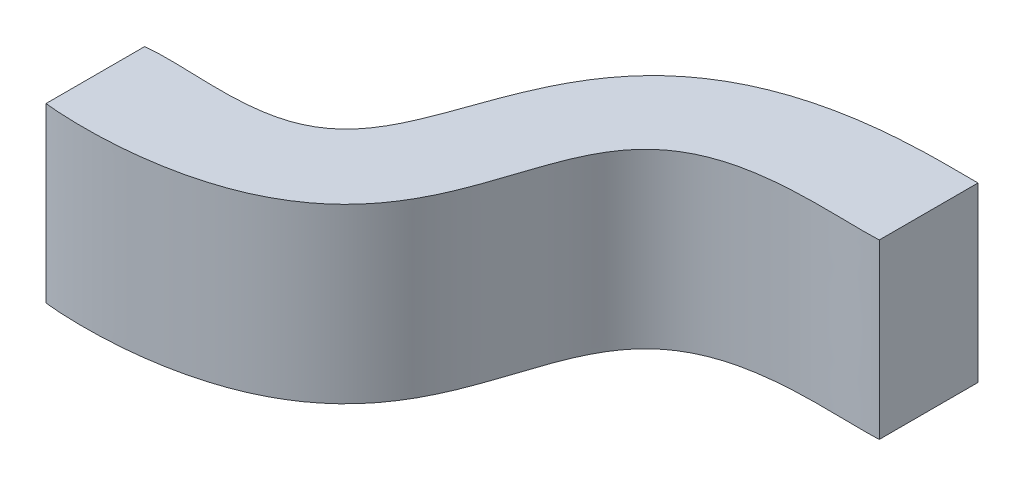
ISO-10303-21;
HEADER;
FILE_DESCRIPTION(('STEP AP214'),'2;1');
FILE_NAME('part.step','',(''),(''),'','','');
FILE_SCHEMA(('AUTOMOTIVE_DESIGN { 1 0 10303 214 1 1 1 1 }'));
ENDSEC;
DATA;
#1=APPLICATION_CONTEXT('core data for automotive mechanical design processes');
#2=APPLICATION_PROTOCOL_DEFINITION('international standard','automotive_design',2000,#1);
#3=PRODUCT_CONTEXT('',#1,'mechanical');
#4=PRODUCT('Part','Part','',(#3));
#5=PRODUCT_RELATED_PRODUCT_CATEGORY('part','',(#4));
#6=PRODUCT_DEFINITION_FORMATION('','',#4);
#7=PRODUCT_DEFINITION_CONTEXT('part definition',#1,'design');
#8=PRODUCT_DEFINITION('design','',#6,#7);
#9=PRODUCT_DEFINITION_SHAPE('','',#8);
#10=(LENGTH_UNIT() NAMED_UNIT(*) SI_UNIT(.MILLI.,.METRE.));
#11=(NAMED_UNIT(*) PLANE_ANGLE_UNIT() SI_UNIT($,.RADIAN.));
#12=(NAMED_UNIT(*) SI_UNIT($,.STERADIAN.) SOLID_ANGLE_UNIT());
#13=UNCERTAINTY_MEASURE_WITH_UNIT(LENGTH_MEASURE(1.E-05),#10,'distance_accuracy_value','');
#14=(GEOMETRIC_REPRESENTATION_CONTEXT(3) GLOBAL_UNCERTAINTY_ASSIGNED_CONTEXT((#13)) GLOBAL_UNIT_ASSIGNED_CONTEXT((#10,
#11,#12)) REPRESENTATION_CONTEXT('',''));
#15=CARTESIAN_POINT('',(0.,0.,0.));
#16=DIRECTION('',(0.,0.,1.));
#17=DIRECTION('',(1.,0.,0.));
#18=AXIS2_PLACEMENT_3D('',#15,#16,#17);
#19=CARTESIAN_POINT('',(3.,1.695,0.269440972087));
#20=DIRECTION('',(1.,0.,0.));
#21=DIRECTION('',(0.,1.,0.));
#22=AXIS2_PLACEMENT_3D('',#19,#20,#21);
#23=PLANE('',#22);
#24=DIRECTION('',(0.,-1.,-7.441666330773E-12));
#25=VECTOR('',#24,1.);
#26=CARTESIAN_POINT('',(2.999999999871,2.115,0.02944097209247));
#27=LINE('',#26,#25);
#28=CARTESIAN_POINT('',(2.999999999871,2.115,0.02944097209247));
#29=VERTEX_POINT('',#28);
#30=CARTESIAN_POINT('',(2.999999999871,1.695,0.02944097208934));
#31=VERTEX_POINT('',#30);
#32=EDGE_CURVE('E59',#29,#31,#27,.T.);
#33=ORIENTED_EDGE('',*,*,#32,.F.);
#34=DIRECTION('',(-5.363006335442E-10,0.,-1.));
#35=VECTOR('',#34,1.);
#36=CARTESIAN_POINT('',(3.,2.115,0.269440972087));
#37=LINE('',#36,#35);
#38=CARTESIAN_POINT('',(3.,2.115,0.269440972087));
#39=VERTEX_POINT('',#38);
#40=EDGE_CURVE('E28',#39,#29,#37,.T.);
#41=ORIENTED_EDGE('',*,*,#40,.F.);
#42=DIRECTION('',(0.,1.,0.));
#43=VECTOR('',#42,1.);
#44=CARTESIAN_POINT('',(3.,1.695,0.269440972087));
#45=LINE('',#44,#43);
#46=CARTESIAN_POINT('',(3.,1.695,0.269440972087));
#47=VERTEX_POINT('',#46);
#48=EDGE_CURVE('E98',#47,#39,#45,.T.);
#49=ORIENTED_EDGE('',*,*,#48,.F.);
#50=DIRECTION('',(5.363024839089E-10,0.,1.));
#51=VECTOR('',#50,1.);
#52=CARTESIAN_POINT('',(2.999999999871,1.695,0.02944097208934));
#53=LINE('',#52,#51);
#54=EDGE_CURVE('E85',#31,#47,#53,.T.);
#55=ORIENTED_EDGE('',*,*,#54,.F.);
#56=EDGE_LOOP('',(#33,#41,#49,#55));
#57=FACE_BOUND('',#56,.T.);
#58=ADVANCED_FACE('F17',(#57),#23,.T.);
#59=CARTESIAN_POINT('',(1.7,1.695,0.995));
#60=DIRECTION('',(1.,0.,0.));
#61=DIRECTION('',(0.,1.,0.));
#62=AXIS2_PLACEMENT_3D('',#59,#60,#61);
#63=PLANE('',#62);
#64=DIRECTION('',(0.,1.,0.));
#65=VECTOR('',#64,1.);
#66=CARTESIAN_POINT('',(1.7,1.695,0.755));
#67=LINE('',#66,#65);
#68=CARTESIAN_POINT('',(1.7,1.695,0.755));
#69=VERTEX_POINT('',#68);
#70=CARTESIAN_POINT('',(1.7,2.115,0.755));
#71=VERTEX_POINT('',#70);
#72=EDGE_CURVE('E112',#69,#71,#67,.T.);
#73=ORIENTED_EDGE('',*,*,#72,.F.);
#74=DIRECTION('',(0.,0.,-1.));
#75=VECTOR('',#74,1.);
#76=CARTESIAN_POINT('',(1.7,1.695,0.995));
#77=LINE('',#76,#75);
#78=CARTESIAN_POINT('',(1.7,1.695,0.995));
#79=VERTEX_POINT('',#78);
#80=EDGE_CURVE('E65',#79,#69,#77,.T.);
#81=ORIENTED_EDGE('',*,*,#80,.F.);
#82=DIRECTION('',(0.,-1.,0.));
#83=VECTOR('',#82,1.);
#84=CARTESIAN_POINT('',(1.7,2.115,0.995));
#85=LINE('',#84,#83);
#86=CARTESIAN_POINT('',(1.7,2.115,0.995));
#87=VERTEX_POINT('',#86);
#88=EDGE_CURVE('E100',#87,#79,#85,.T.);
#89=ORIENTED_EDGE('',*,*,#88,.F.);
#90=DIRECTION('',(0.,0.,1.));
#91=VECTOR('',#90,1.);
#92=CARTESIAN_POINT('',(1.7,2.115,0.755));
#93=LINE('',#92,#91);
#94=EDGE_CURVE('E11',#71,#87,#93,.T.);
#95=ORIENTED_EDGE('',*,*,#94,.F.);
#96=EDGE_LOOP('',(#73,#81,#89,#95));
#97=FACE_BOUND('',#96,.T.);
#98=ADVANCED_FACE('F144',(#97),#63,.F.);
#99=CARTESIAN_POINT('',(1.7,2.115,0.995));
#100=DIRECTION('',(0.,-1.,0.));
#101=DIRECTION('',(0.,0.,-1.));
#102=AXIS2_PLACEMENT_3D('',#99,#100,#101);
#103=PLANE('',#102);
#104=ORIENTED_EDGE('',*,*,#40,.T.);
#105=CARTESIAN_POINT('',(1.7,2.115,0.755));
#106=CARTESIAN_POINT('',(1.728643494388,2.115,0.7518517855596));
#107=CARTESIAN_POINT('',(1.795333284024,2.115,0.7529114508954));
#108=CARTESIAN_POINT('',(1.900115249547,2.115,0.7568374269966));
#109=CARTESIAN_POINT('',(1.994893083273,2.115,0.7498880741509));
#110=CARTESIAN_POINT('',(2.072220157247,2.115,0.7244576197296));
#111=CARTESIAN_POINT('',(2.130616950677,2.115,0.6776761088199));
#112=CARTESIAN_POINT('',(2.173215353715,2.115,0.6105274657353));
#113=CARTESIAN_POINT('',(2.206407799143,2.115,0.5269706962931));
#114=CARTESIAN_POINT('',(2.238495100883,2.115,0.4330602488143));
#115=CARTESIAN_POINT('',(2.278334637343,2.115,0.3360665994647));
#116=CARTESIAN_POINT('',(2.333988448561,2.115,0.2435967815106));
#117=CARTESIAN_POINT('',(2.411371333342,2.115,0.1627149145743));
#118=CARTESIAN_POINT('',(2.512899032616,2.115,0.09906278997502));
#119=CARTESIAN_POINT('',(2.636136067925,2.115,0.05598023172917));
#120=CARTESIAN_POINT('',(2.772444873154,2.115,0.03362629882847));
#121=CARTESIAN_POINT('',(2.905630098084,2.115,0.02809734675068));
#122=CARTESIAN_POINT('',(2.975610653613,2.115,0.02973698941307));
#123=CARTESIAN_POINT('',(2.999999999871,2.115,0.02944097209247));
#124=B_SPLINE_CURVE_WITH_KNOTS('',3,(#105,#106,#107,#108,#109,#110,#111,#112,#113,#114,#115,
#116,#117,#118,#119,#120,#121,#122,#123),.UNSPECIFIED.,.F.,.F.,(4,1,1,1,1,1,1,1,1,1,1,1,1,1,1,1,
4),(0.,0.06250000001045,0.1250000000207,0.1875000000311,0.2500000000413,0.3125000000517,
0.375000000062,0.4375000000722,0.5000000000826,0.5625000000929,0.6250000001032,0.6875000001135,
0.7500000001237,0.8125000001341,0.8750000001444,0.9375000001546,1.),.UNSPECIFIED.);
#125=EDGE_CURVE('E117',#71,#29,#124,.T.);
#126=ORIENTED_EDGE('',*,*,#125,.F.);
#127=ORIENTED_EDGE('',*,*,#94,.T.);
#128=CARTESIAN_POINT('',(3.,2.115,0.269440972087));
#129=CARTESIAN_POINT('',(2.972739674819,2.115,0.2707819413465));
#130=CARTESIAN_POINT('',(2.903069519715,2.115,0.2690293220586));
#131=CARTESIAN_POINT('',(2.785338777859,2.115,0.2689332965312));
#132=CARTESIAN_POINT('',(2.675349164177,2.115,0.2817078173698));
#133=CARTESIAN_POINT('',(2.584588029793,2.115,0.3129701023117));
#134=CARTESIAN_POINT('',(2.51675546186,2.115,0.3643581895776));
#135=CARTESIAN_POINT('',(2.469479097315,2.115,0.4342821681339));
#136=CARTESIAN_POINT('',(2.436022829838,2.115,0.5186727326671));
#137=CARTESIAN_POINT('',(2.406997152547,2.115,0.6117304551543));
#138=CARTESIAN_POINT('',(2.372069064508,2.115,0.7066748653404));
#139=CARTESIAN_POINT('',(2.321672086288,2.115,0.7964935789889));
#140=CARTESIAN_POINT('',(2.248716275502,2.115,0.8746914261329));
#141=CARTESIAN_POINT('',(2.150298133324,2.115,0.9360395315528));
#142=CARTESIAN_POINT('',(2.029410947185,2.115,0.9773245863457));
#143=CARTESIAN_POINT('',(1.896653497727,2.115,0.9980974029006));
#144=CARTESIAN_POINT('',(1.771944872564,2.115,1.001424145161));
#145=CARTESIAN_POINT('',(1.714792616559,2.115,0.9968930979407));
#146=CARTESIAN_POINT('',(1.7,2.115,0.995));
#147=B_SPLINE_CURVE_WITH_KNOTS('',3,(#128,#129,#130,#131,#132,#133,#134,#135,#136,#137,#138,
#139,#140,#141,#142,#143,#144,#145,#146),.UNSPECIFIED.,.F.,.F.,(4,1,1,1,1,1,1,1,1,1,1,1,1,1,1,1,
4),(0.,0.06250000000019,0.1250000000002,0.1875000000002,0.2500000000002,0.3125000000003,
0.3750000000002,0.4375000000002,0.5000000000002,0.5625000000002,0.6250000000002,0.6875000000001,
0.7500000000002,0.8125000000002,0.8750000000002,0.9375000000002,1.),.UNSPECIFIED.);
#148=EDGE_CURVE('E21',#39,#87,#147,.T.);
#149=ORIENTED_EDGE('',*,*,#148,.F.);
#150=EDGE_LOOP('',(#104,#126,#127,#149));
#151=FACE_BOUND('',#150,.T.);
#152=ADVANCED_FACE('F19',(#151),#103,.F.);
#153=CARTESIAN_POINT('',(1.683640348767,2.115,0.7573154890361));
#154=CARTESIAN_POINT('',(1.688890946943,2.115,0.7563839724333));
#155=CARTESIAN_POINT('',(1.722070957262,2.115,0.7517473514356));
#156=CARTESIAN_POINT('',(1.795333284024,2.115,0.7529114508954));
#157=CARTESIAN_POINT('',(1.900115249547,2.115,0.7568374269966));
#158=CARTESIAN_POINT('',(1.994893083273,2.115,0.7498880741509));
#159=CARTESIAN_POINT('',(2.072220157247,2.115,0.7244576197296));
#160=CARTESIAN_POINT('',(2.130616950677,2.115,0.6776761088199));
#161=CARTESIAN_POINT('',(2.173215353715,2.115,0.6105274657353));
#162=CARTESIAN_POINT('',(2.206407799143,2.115,0.5269706962931));
#163=CARTESIAN_POINT('',(2.238495100883,2.115,0.4330602488143));
#164=CARTESIAN_POINT('',(2.278334637343,2.115,0.3360665994647));
#165=CARTESIAN_POINT('',(2.333988448561,2.115,0.2435967815106));
#166=CARTESIAN_POINT('',(2.411371333342,2.115,0.1627149145743));
#167=CARTESIAN_POINT('',(2.512899032615,2.115,0.09906278997499));
#168=CARTESIAN_POINT('',(2.636136067927,2.115,0.05598023172927));
#169=CARTESIAN_POINT('',(2.772444873146,2.115,0.03362629882808));
#170=CARTESIAN_POINT('',(2.905630098114,2.115,0.02809734675213));
#171=CARTESIAN_POINT('',(2.982867393509,2.115,0.02990701464513));
#172=CARTESIAN_POINT('',(3.009660395097,2.115,0.02927019391794));
#173=CARTESIAN_POINT('',(3.013754026833,2.115,0.02909098308841));
#174=(BOUNDED_CURVE() B_SPLINE_CURVE(3,(#153,#154,#155,#156,#157,#158,#159,#160,#161,#162,#163,
#164,#165,#166,#167,#168,#169,#170,#171,#172,#173),.UNSPECIFIED.,.F.,
.F.) B_SPLINE_CURVE_WITH_KNOTS((4,1,1,1,1,1,1,1,1,1,1,1,1,1,1,1,1,1,4),(0.,0.01201546762312,
0.07297434795032,0.1339332282773,0.1948921086045,0.2558509889315,0.3168098692586,
0.3777687495856,0.4387276299127,0.4996865102398,0.5606453905668,0.6216042708939,0.682563151221,
0.743522031548,0.8044809118751,0.8654397922021,0.9263986725292,0.9873575526954,1.),
.UNSPECIFIED.) CURVE() GEOMETRIC_REPRESENTATION_ITEM() RATIONAL_B_SPLINE_CURVE((1.,1.,1.,1.,1.,
1.,1.,1.,1.,1.,1.,1.,1.,1.,1.,1.,1.,1.,1.,1.,1.)) REPRESENTATION_ITEM(''));
#175=DIRECTION('',(0.,-1.,0.));
#176=VECTOR('',#175,1.);
#177=SURFACE_OF_LINEAR_EXTRUSION('',#174,#176);
#178=ORIENTED_EDGE('',*,*,#32,.T.);
#179=CARTESIAN_POINT('',(2.999999999871,1.695,0.02944097208934));
#180=CARTESIAN_POINT('',(2.975610653613,1.695,0.02973698940995));
#181=CARTESIAN_POINT('',(2.905630098084,1.695,0.02809734675213));
#182=CARTESIAN_POINT('',(2.772444873154,1.695,0.03362629882808));
#183=CARTESIAN_POINT('',(2.636136067925,1.695,0.05598023172927));
#184=CARTESIAN_POINT('',(2.512899032616,1.695,0.09906278997499));
#185=CARTESIAN_POINT('',(2.411371333342,1.695,0.1627149145743));
#186=CARTESIAN_POINT('',(2.333988448561,1.695,0.2435967815106));
#187=CARTESIAN_POINT('',(2.278334637343,1.695,0.3360665994647));
#188=CARTESIAN_POINT('',(2.238495100883,1.695,0.4330602488143));
#189=CARTESIAN_POINT('',(2.206407799143,1.695,0.5269706962931));
#190=CARTESIAN_POINT('',(2.173215353715,1.695,0.6105274657353));
#191=CARTESIAN_POINT('',(2.130616950677,1.695,0.6776761088199));
#192=CARTESIAN_POINT('',(2.072220157247,1.695,0.7244576197296));
#193=CARTESIAN_POINT('',(1.994893083273,1.695,0.7498880741509));
#194=CARTESIAN_POINT('',(1.900115249547,1.695,0.7568374269966));
#195=CARTESIAN_POINT('',(1.795333284024,1.695,0.7529114508954));
#196=CARTESIAN_POINT('',(1.728643494388,1.695,0.7518517855596));
#197=CARTESIAN_POINT('',(1.7,1.695,0.755));
#198=B_SPLINE_CURVE_WITH_KNOTS('',3,(#179,#180,#181,#182,#183,#184,#185,#186,#187,#188,#189,
#190,#191,#192,#193,#194,#195,#196,#197),.UNSPECIFIED.,.F.,.F.,(4,1,1,1,1,1,1,1,1,1,1,1,1,1,1,1,
4),(0.,0.06249999984537,0.1249999998556,0.1874999998659,0.2499999998763,0.3124999998865,
0.3749999998968,0.4374999999071,0.4999999999174,0.5624999999278,0.624999999938,0.6874999999483,
0.7499999999587,0.8124999999689,0.8749999999793,0.9374999999896,1.),.UNSPECIFIED.);
#199=EDGE_CURVE('E89',#31,#69,#198,.T.);
#200=ORIENTED_EDGE('',*,*,#199,.T.);
#201=ORIENTED_EDGE('',*,*,#72,.T.);
#202=ORIENTED_EDGE('',*,*,#125,.T.);
#203=EDGE_LOOP('',(#178,#200,#201,#202));
#204=FACE_BOUND('',#203,.T.);
#205=ADVANCED_FACE('F143',(#204),#177,.T.);
#206=CARTESIAN_POINT('',(1.7,1.695,0.755));
#207=DIRECTION('',(0.,1.,0.));
#208=DIRECTION('',(1.,0.,0.));
#209=AXIS2_PLACEMENT_3D('',#206,#207,#208);
#210=PLANE('',#209);
#211=ORIENTED_EDGE('',*,*,#54,.T.);
#212=CARTESIAN_POINT('',(1.7,1.695,0.995));
#213=CARTESIAN_POINT('',(1.714792616559,1.695,0.9968930979407));
#214=CARTESIAN_POINT('',(1.771944872564,1.695,1.001424145161));
#215=CARTESIAN_POINT('',(1.896653497727,1.695,0.9980974029006));
#216=CARTESIAN_POINT('',(2.029410947185,1.695,0.9773245863457));
#217=CARTESIAN_POINT('',(2.150298133324,1.695,0.9360395315528));
#218=CARTESIAN_POINT('',(2.248716275502,1.695,0.8746914261329));
#219=CARTESIAN_POINT('',(2.321672086288,1.695,0.7964935789889));
#220=CARTESIAN_POINT('',(2.372069064508,1.695,0.7066748653404));
#221=CARTESIAN_POINT('',(2.406997152547,1.695,0.6117304551543));
#222=CARTESIAN_POINT('',(2.436022829838,1.695,0.5186727326671));
#223=CARTESIAN_POINT('',(2.469479097315,1.695,0.4342821681339));
#224=CARTESIAN_POINT('',(2.51675546186,1.695,0.3643581895776));
#225=CARTESIAN_POINT('',(2.584588029793,1.695,0.3129701023117));
#226=CARTESIAN_POINT('',(2.675349164177,1.695,0.2817078173698));
#227=CARTESIAN_POINT('',(2.785338777859,1.695,0.2689332965312));
#228=CARTESIAN_POINT('',(2.903069519715,1.695,0.2690293220586));
#229=CARTESIAN_POINT('',(2.972739674819,1.695,0.2707819413465));
#230=CARTESIAN_POINT('',(3.,1.695,0.269440972087));
#231=B_SPLINE_CURVE_WITH_KNOTS('',3,(#212,#213,#214,#215,#216,#217,#218,#219,#220,#221,#222,
#223,#224,#225,#226,#227,#228,#229,#230),.UNSPECIFIED.,.F.,.F.,(4,1,1,1,1,1,1,1,1,1,1,1,1,1,1,1,
4),(0.,0.06249999999985,0.1249999999998,0.1874999999998,0.2499999999998,0.3124999999999,
0.3749999999998,0.4374999999998,0.4999999999998,0.5624999999998,0.6249999999998,0.6874999999997,
0.7499999999998,0.8124999999998,0.8749999999998,0.9374999999998,1.),.UNSPECIFIED.);
#232=EDGE_CURVE('E84',#79,#47,#231,.T.);
#233=ORIENTED_EDGE('',*,*,#232,.F.);
#234=ORIENTED_EDGE('',*,*,#80,.T.);
#235=ORIENTED_EDGE('',*,*,#199,.F.);
#236=EDGE_LOOP('',(#211,#233,#234,#235));
#237=FACE_BOUND('',#236,.T.);
#238=ADVANCED_FACE('F83',(#237),#210,.F.);
#239=CARTESIAN_POINT('',(1.690272156831,1.695,0.9933645255741));
#240=CARTESIAN_POINT('',(1.691944156974,1.695,0.9938265537065));
#241=CARTESIAN_POINT('',(1.705648255598,1.695,0.9961681303855));
#242=CARTESIAN_POINT('',(1.771944872564,1.695,1.001424145161));
#243=CARTESIAN_POINT('',(1.896653497727,1.695,0.9980974029006));
#244=CARTESIAN_POINT('',(2.029410947185,1.695,0.9773245863457));
#245=CARTESIAN_POINT('',(2.150298133324,1.695,0.9360395315528));
#246=CARTESIAN_POINT('',(2.248716275502,1.695,0.8746914261329));
#247=CARTESIAN_POINT('',(2.321672086288,1.695,0.7964935789889));
#248=CARTESIAN_POINT('',(2.372069064508,1.695,0.7066748653404));
#249=CARTESIAN_POINT('',(2.406997152547,1.695,0.6117304551543));
#250=CARTESIAN_POINT('',(2.436022829838,1.695,0.5186727326671));
#251=CARTESIAN_POINT('',(2.469479097315,1.695,0.4342821681339));
#252=CARTESIAN_POINT('',(2.51675546186,1.695,0.3643581895776));
#253=CARTESIAN_POINT('',(2.584588029793,1.695,0.3129701023117));
#254=CARTESIAN_POINT('',(2.675349164177,1.695,0.2817078173698));
#255=CARTESIAN_POINT('',(2.785338777859,1.695,0.2689332965312));
#256=CARTESIAN_POINT('',(2.903069519715,1.695,0.2690293220586));
#257=CARTESIAN_POINT('',(2.979441313988,1.695,0.27095052748));
#258=CARTESIAN_POINT('',(3.010208439825,1.695,0.2688429523257));
#259=CARTESIAN_POINT('',(3.014853899135,1.695,0.268402054242));
#260=(BOUNDED_CURVE() B_SPLINE_CURVE(3,(#239,#240,#241,#242,#243,#244,#245,#246,#247,#248,#249,
#250,#251,#252,#253,#254,#255,#256,#257,#258,#259),.UNSPECIFIED.,.F.,
.F.) B_SPLINE_CURVE_WITH_KNOTS((4,1,1,1,1,1,1,1,1,1,1,1,1,1,1,1,1,1,4),(0.,0.01937939671657,
0.07994001145569,0.1405006261949,0.2010612409342,0.2616218556735,0.3221824704128,0.382743085152,
0.4433036998913,0.5038643146306,0.5644249293698,0.6249855441091,0.6855461588483,0.7461067735876,
0.8066673883269,0.8672280030662,0.9277886178055,0.9883492325449,1.),
.UNSPECIFIED.) CURVE() GEOMETRIC_REPRESENTATION_ITEM() RATIONAL_B_SPLINE_CURVE((1.,1.,1.,1.,1.,
1.,1.,1.,1.,1.,1.,1.,1.,1.,1.,1.,1.,1.,1.,1.,1.)) REPRESENTATION_ITEM(''));
#261=DIRECTION('',(0.,1.,0.));
#262=VECTOR('',#261,1.);
#263=SURFACE_OF_LINEAR_EXTRUSION('',#260,#262);
#264=ORIENTED_EDGE('',*,*,#48,.T.);
#265=ORIENTED_EDGE('',*,*,#148,.T.);
#266=ORIENTED_EDGE('',*,*,#88,.T.);
#267=ORIENTED_EDGE('',*,*,#232,.T.);
#268=EDGE_LOOP('',(#264,#265,#266,#267));
#269=FACE_BOUND('',#268,.T.);
#270=ADVANCED_FACE('F95',(#269),#263,.T.);
#271=CLOSED_SHELL('',(#58,#98,#152,#205,#238,#270));
#272=MANIFOLD_SOLID_BREP('B1',#271);
#273=ADVANCED_BREP_SHAPE_REPRESENTATION('',(#18,#272),#14);
#274=SHAPE_DEFINITION_REPRESENTATION(#9,#273);
ENDSEC;
END-ISO-10303-21;
